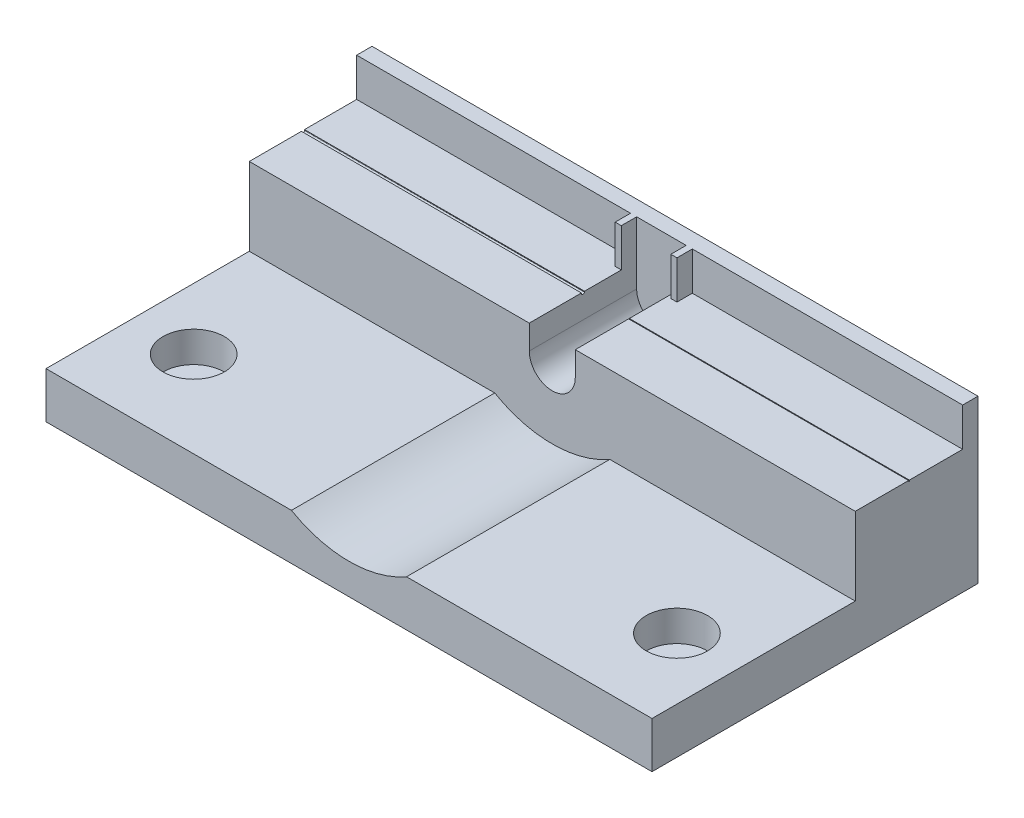
ISO-10303-21;
HEADER;
FILE_DESCRIPTION(('STEP AP214'),'2;1');
FILE_NAME('part.step','',(''),(''),'','','');
FILE_SCHEMA(('AUTOMOTIVE_DESIGN { 1 0 10303 214 1 1 1 1 }'));
ENDSEC;
DATA;
#1=APPLICATION_CONTEXT('core data for automotive mechanical design processes');
#2=APPLICATION_PROTOCOL_DEFINITION('international standard','automotive_design',2000,#1);
#3=PRODUCT_CONTEXT('',#1,'mechanical');
#4=PRODUCT('Part','Part','',(#3));
#5=PRODUCT_RELATED_PRODUCT_CATEGORY('part','',(#4));
#6=PRODUCT_DEFINITION_FORMATION('','',#4);
#7=PRODUCT_DEFINITION_CONTEXT('part definition',#1,'design');
#8=PRODUCT_DEFINITION('design','',#6,#7);
#9=PRODUCT_DEFINITION_SHAPE('','',#8);
#10=(LENGTH_UNIT() NAMED_UNIT(*) SI_UNIT(.MILLI.,.METRE.));
#11=(NAMED_UNIT(*) PLANE_ANGLE_UNIT() SI_UNIT($,.RADIAN.));
#12=(NAMED_UNIT(*) SI_UNIT($,.STERADIAN.) SOLID_ANGLE_UNIT());
#13=UNCERTAINTY_MEASURE_WITH_UNIT(LENGTH_MEASURE(1.E-05),#10,'distance_accuracy_value','');
#14=(GEOMETRIC_REPRESENTATION_CONTEXT(3) GLOBAL_UNCERTAINTY_ASSIGNED_CONTEXT((#13)) GLOBAL_UNIT_ASSIGNED_CONTEXT((#10,
#11,#12)) REPRESENTATION_CONTEXT('',''));
#15=CARTESIAN_POINT('',(0.,0.,0.));
#16=DIRECTION('',(0.,0.,1.));
#17=DIRECTION('',(1.,0.,0.));
#18=AXIS2_PLACEMENT_3D('',#15,#16,#17);
#19=CARTESIAN_POINT('',(-1.5,-1.425,-20.25));
#20=DIRECTION('',(0.,-1.,0.));
#21=DIRECTION('',(0.,0.,-1.));
#22=AXIS2_PLACEMENT_3D('',#19,#20,#21);
#23=PLANE('',#22);
#24=DIRECTION('',(0.,0.,1.));
#25=VECTOR('',#24,1.);
#26=CARTESIAN_POINT('',(-1.5,-1.425,-20.25));
#27=LINE('',#26,#25);
#28=CARTESIAN_POINT('',(-1.5,-1.425,-16.65));
#29=VERTEX_POINT('',#28);
#30=CARTESIAN_POINT('',(-1.5,-1.425,-13.25));
#31=VERTEX_POINT('',#30);
#32=EDGE_CURVE('E375',#29,#31,#27,.T.);
#33=ORIENTED_EDGE('',*,*,#32,.F.);
#34=DIRECTION('',(-1.,0.,0.));
#35=VECTOR('',#34,1.);
#36=CARTESIAN_POINT('',(-1.26037774849503,-1.425,-16.65));
#37=LINE('',#36,#35);
#38=CARTESIAN_POINT('',(-19.75,-1.425,-16.65));
#39=VERTEX_POINT('',#38);
#40=EDGE_CURVE('E533',#29,#39,#37,.T.);
#41=ORIENTED_EDGE('',*,*,#40,.T.);
#42=DIRECTION('',(0.,0.,1.));
#43=VECTOR('',#42,1.);
#44=CARTESIAN_POINT('',(-19.75,-1.425,-20.25));
#45=LINE('',#44,#43);
#46=CARTESIAN_POINT('',(-19.75,-1.425,-13.25));
#47=VERTEX_POINT('',#46);
#48=EDGE_CURVE('E288',#39,#47,#45,.T.);
#49=ORIENTED_EDGE('',*,*,#48,.T.);
#50=DIRECTION('',(1.,0.,0.));
#51=VECTOR('',#50,1.);
#52=CARTESIAN_POINT('',(-1.5,-1.425,-13.25));
#53=LINE('',#52,#51);
#54=EDGE_CURVE('E359',#47,#31,#53,.T.);
#55=ORIENTED_EDGE('',*,*,#54,.T.);
#56=EDGE_LOOP('',(#33,#41,#49,#55));
#57=FACE_BOUND('',#56,.T.);
#58=ADVANCED_FACE('F71',(#57),#23,.F.);
#59=CARTESIAN_POINT('',(1.5,-1.425,-20.25));
#60=DIRECTION('',(0.,-1.,0.));
#61=DIRECTION('',(1.,0.,0.));
#62=AXIS2_PLACEMENT_3D('',#59,#60,#61);
#63=PLANE('',#62);
#64=DIRECTION('',(0.,0.,1.));
#65=VECTOR('',#64,1.);
#66=CARTESIAN_POINT('',(19.75,-1.425,-20.25));
#67=LINE('',#66,#65);
#68=CARTESIAN_POINT('',(19.75,-1.425,-16.725));
#69=VERTEX_POINT('',#68);
#70=CARTESIAN_POINT('',(19.75,-1.425,-13.25));
#71=VERTEX_POINT('',#70);
#72=EDGE_CURVE('E287',#69,#71,#67,.T.);
#73=ORIENTED_EDGE('',*,*,#72,.F.);
#74=DIRECTION('',(1.,0.,0.));
#75=VECTOR('',#74,1.);
#76=CARTESIAN_POINT('',(1.4098612181134,-1.425,-16.725));
#77=LINE('',#76,#75);
#78=CARTESIAN_POINT('',(1.5,-1.425,-16.725));
#79=VERTEX_POINT('',#78);
#80=EDGE_CURVE('E549',#79,#69,#77,.T.);
#81=ORIENTED_EDGE('',*,*,#80,.F.);
#82=DIRECTION('',(0.,0.,1.));
#83=VECTOR('',#82,1.);
#84=CARTESIAN_POINT('',(1.5,-1.425,-20.25));
#85=LINE('',#84,#83);
#86=CARTESIAN_POINT('',(1.5,-1.425,-13.25));
#87=VERTEX_POINT('',#86);
#88=EDGE_CURVE('E297',#79,#87,#85,.T.);
#89=ORIENTED_EDGE('',*,*,#88,.T.);
#90=DIRECTION('',(1.,0.,0.));
#91=VECTOR('',#90,1.);
#92=CARTESIAN_POINT('',(1.5,-1.425,-13.25));
#93=LINE('',#92,#91);
#94=EDGE_CURVE('E395',#87,#71,#93,.T.);
#95=ORIENTED_EDGE('',*,*,#94,.T.);
#96=EDGE_LOOP('',(#73,#81,#89,#95));
#97=FACE_BOUND('',#96,.T.);
#98=ADVANCED_FACE('F578',(#97),#63,.F.);
#99=CARTESIAN_POINT('',(1.5,-1.425,-20.25));
#100=VERTEX_POINT('',#99);
#101=CARTESIAN_POINT('',(1.5,-1.425,-16.775));
#102=VERTEX_POINT('',#101);
#103=EDGE_CURVE('E298',#100,#102,#85,.T.);
#104=ORIENTED_EDGE('',*,*,#103,.T.);
#105=DIRECTION('',(1.,0.,0.));
#106=VECTOR('',#105,1.);
#107=CARTESIAN_POINT('',(1.4098612181134,-1.425,-16.775));
#108=LINE('',#107,#106);
#109=CARTESIAN_POINT('',(19.75,-1.425,-16.775));
#110=VERTEX_POINT('',#109);
#111=EDGE_CURVE('E559',#102,#110,#108,.T.);
#112=ORIENTED_EDGE('',*,*,#111,.T.);
#113=CARTESIAN_POINT('',(19.75,-1.425,-20.25));
#114=VERTEX_POINT('',#113);
#115=EDGE_CURVE('E290',#114,#110,#67,.T.);
#116=ORIENTED_EDGE('',*,*,#115,.F.);
#117=DIRECTION('',(1.,0.,0.));
#118=VECTOR('',#117,1.);
#119=CARTESIAN_POINT('',(1.5,-1.425,-20.25));
#120=LINE('',#119,#118);
#121=CARTESIAN_POINT('',(2.12919977469738,-1.425,-20.25));
#122=VERTEX_POINT('',#121);
#123=EDGE_CURVE('E486',#122,#114,#120,.T.);
#124=ORIENTED_EDGE('',*,*,#123,.F.);
#125=DIRECTION('',(0.,0.,-1.));
#126=VECTOR('',#125,1.);
#127=CARTESIAN_POINT('',(2.12919977469738,-1.425,-19.25));
#128=LINE('',#127,#126);
#129=CARTESIAN_POINT('',(2.12919977469738,-1.425,-19.25));
#130=VERTEX_POINT('',#129);
#131=EDGE_CURVE('E423',#130,#122,#128,.T.);
#132=ORIENTED_EDGE('',*,*,#131,.F.);
#133=DIRECTION('',(1.,0.,0.));
#134=VECTOR('',#133,1.);
#135=CARTESIAN_POINT('',(1.72919977469738,-1.425,-19.25));
#136=LINE('',#135,#134);
#137=CARTESIAN_POINT('',(1.72919977469738,-1.425,-19.25));
#138=VERTEX_POINT('',#137);
#139=EDGE_CURVE('E454',#138,#130,#136,.T.);
#140=ORIENTED_EDGE('',*,*,#139,.F.);
#141=DIRECTION('',(0.,0.,-1.));
#142=VECTOR('',#141,1.);
#143=CARTESIAN_POINT('',(1.72919977469738,-1.425,-19.25));
#144=LINE('',#143,#142);
#145=CARTESIAN_POINT('',(1.72919977469738,-1.425,-20.25));
#146=VERTEX_POINT('',#145);
#147=EDGE_CURVE('E446',#138,#146,#144,.T.);
#148=ORIENTED_EDGE('',*,*,#147,.T.);
#149=EDGE_CURVE('E385',#100,#146,#120,.T.);
#150=ORIENTED_EDGE('',*,*,#149,.F.);
#151=EDGE_LOOP('',(#104,#112,#116,#124,#132,#140,#148,#150));
#152=FACE_BOUND('',#151,.T.);
#153=ADVANCED_FACE('F506',(#152),#63,.F.);
#154=CARTESIAN_POINT('',(-19.75,-6.4951905283833,-13.25));
#155=DIRECTION('',(-1.,0.,0.));
#156=DIRECTION('',(0.,0.,1.));
#157=AXIS2_PLACEMENT_3D('',#154,#155,#156);
#158=PLANE('',#157);
#159=DIRECTION('',(0.,1.,0.));
#160=VECTOR('',#159,1.);
#161=CARTESIAN_POINT('',(-19.75,-1.425,-16.65));
#162=LINE('',#161,#160);
#163=CARTESIAN_POINT('',(-19.75,-1.475,-16.65));
#164=VERTEX_POINT('',#163);
#165=EDGE_CURVE('E272',#164,#39,#162,.T.);
#166=ORIENTED_EDGE('',*,*,#165,.F.);
#167=CARTESIAN_POINT('',(-19.75,-1.455,-16.75));
#168=DIRECTION('',(-1.,0.,0.));
#169=DIRECTION('',(0.,0.,1.));
#170=AXIS2_PLACEMENT_3D('',#167,#168,#169);
#171=CIRCLE('',#170,0.101980390271854);
#172=CARTESIAN_POINT('',(-19.75,-1.475,-16.85));
#173=VERTEX_POINT('',#172);
#174=EDGE_CURVE('E279',#173,#164,#171,.T.);
#175=ORIENTED_EDGE('',*,*,#174,.F.);
#176=DIRECTION('',(0.,-1.,0.));
#177=VECTOR('',#176,1.);
#178=CARTESIAN_POINT('',(-19.75,-1.425,-16.85));
#179=LINE('',#178,#177);
#180=CARTESIAN_POINT('',(-19.75,-1.425,-16.85));
#181=VERTEX_POINT('',#180);
#182=EDGE_CURVE('E264',#181,#173,#179,.T.);
#183=ORIENTED_EDGE('',*,*,#182,.F.);
#184=CARTESIAN_POINT('',(-19.75,-1.425,-20.25));
#185=VERTEX_POINT('',#184);
#186=EDGE_CURVE('E276',#185,#181,#45,.T.);
#187=ORIENTED_EDGE('',*,*,#186,.F.);
#188=DIRECTION('',(0.,1.,0.));
#189=VECTOR('',#188,1.);
#190=CARTESIAN_POINT('',(-19.75,0.,-20.25));
#191=LINE('',#190,#189);
#192=CARTESIAN_POINT('',(-19.75,1.075,-20.25));
#193=VERTEX_POINT('',#192);
#194=EDGE_CURVE('E427',#185,#193,#191,.T.);
#195=ORIENTED_EDGE('',*,*,#194,.T.);
#196=DIRECTION('',(0.,0.,1.));
#197=VECTOR('',#196,1.);
#198=CARTESIAN_POINT('',(-19.75,1.075,-21.25));
#199=LINE('',#198,#197);
#200=CARTESIAN_POINT('',(-19.75,1.075,-21.25));
#201=VERTEX_POINT('',#200);
#202=EDGE_CURVE('E420',#201,#193,#199,.T.);
#203=ORIENTED_EDGE('',*,*,#202,.F.);
#204=DIRECTION('',(0.,1.,0.));
#205=VECTOR('',#204,1.);
#206=CARTESIAN_POINT('',(-19.75,0.,-21.25));
#207=LINE('',#206,#205);
#208=CARTESIAN_POINT('',(-19.75,-9.5,-21.25));
#209=VERTEX_POINT('',#208);
#210=EDGE_CURVE('E344',#209,#201,#207,.T.);
#211=ORIENTED_EDGE('',*,*,#210,.F.);
#212=DIRECTION('',(0.,0.,1.));
#213=VECTOR('',#212,1.);
#214=CARTESIAN_POINT('',(-19.75,-9.5,-13.25));
#215=LINE('',#214,#213);
#216=CARTESIAN_POINT('',(-19.75,-9.5,0.));
#217=VERTEX_POINT('',#216);
#218=EDGE_CURVE('E75',#209,#217,#215,.T.);
#219=ORIENTED_EDGE('',*,*,#218,.T.);
#220=DIRECTION('',(0.,-1.,0.));
#221=VECTOR('',#220,1.);
#222=CARTESIAN_POINT('',(-19.75,-6.4951905283833,0.));
#223=LINE('',#222,#221);
#224=CARTESIAN_POINT('',(-19.75,-6.4951905283833,0.));
#225=VERTEX_POINT('',#224);
#226=EDGE_CURVE('E304',#225,#217,#223,.T.);
#227=ORIENTED_EDGE('',*,*,#226,.F.);
#228=DIRECTION('',(0.,0.,1.));
#229=VECTOR('',#228,1.);
#230=CARTESIAN_POINT('',(-19.75,-6.4951905283833,-13.25));
#231=LINE('',#230,#229);
#232=CARTESIAN_POINT('',(-19.75,-6.4951905283833,-13.25));
#233=VERTEX_POINT('',#232);
#234=EDGE_CURVE('E12',#233,#225,#231,.T.);
#235=ORIENTED_EDGE('',*,*,#234,.F.);
#236=DIRECTION('',(0.,1.,0.));
#237=VECTOR('',#236,1.);
#238=CARTESIAN_POINT('',(-19.75,-1.425,-13.25));
#239=LINE('',#238,#237);
#240=EDGE_CURVE('E356',#233,#47,#239,.T.);
#241=ORIENTED_EDGE('',*,*,#240,.T.);
#242=ORIENTED_EDGE('',*,*,#48,.F.);
#243=EDGE_LOOP('',(#166,#175,#183,#187,#195,#203,#211,#219,#227,#235,#241,#242));
#244=FACE_BOUND('',#243,.T.);
#245=ADVANCED_FACE('F73',(#244),#158,.T.);
#246=CARTESIAN_POINT('',(-3.74999999999998,-6.4951905283833,-13.25));
#247=DIRECTION('',(0.,1.,0.));
#248=DIRECTION('',(-1.,0.,0.));
#249=AXIS2_PLACEMENT_3D('',#246,#247,#248);
#250=PLANE('',#249);
#251=CARTESIAN_POINT('',(-15.75,-6.4951905283833,-5.625));
#252=DIRECTION('',(0.,1.,0.));
#253=DIRECTION('',(-1.,0.,0.));
#254=AXIS2_PLACEMENT_3D('',#251,#252,#253);
#255=CIRCLE('',#254,2.);
#256=CARTESIAN_POINT('',(-17.75,-6.4951905283833,-5.625));
#257=VERTEX_POINT('',#256);
#258=EDGE_CURVE('E659',#257,#257,#255,.T.);
#259=ORIENTED_EDGE('',*,*,#258,.F.);
#260=EDGE_LOOP('',(#259));
#261=FACE_BOUND('',#260,.T.);
#262=DIRECTION('',(-1.,0.,0.));
#263=VECTOR('',#262,1.);
#264=CARTESIAN_POINT('',(-3.74999999999998,-6.4951905283833,0.));
#265=LINE('',#264,#263);
#266=CARTESIAN_POINT('',(-3.74999999999998,-6.4951905283833,0.));
#267=VERTEX_POINT('',#266);
#268=EDGE_CURVE('E309',#267,#225,#265,.T.);
#269=ORIENTED_EDGE('',*,*,#268,.F.);
#270=DIRECTION('',(0.,0.,1.));
#271=VECTOR('',#270,1.);
#272=CARTESIAN_POINT('',(-3.74999999999998,-6.4951905283833,-13.25));
#273=LINE('',#272,#271);
#274=CARTESIAN_POINT('',(-3.74999999999998,-6.4951905283833,-13.25));
#275=VERTEX_POINT('',#274);
#276=EDGE_CURVE('E80',#275,#267,#273,.T.);
#277=ORIENTED_EDGE('',*,*,#276,.F.);
#278=DIRECTION('',(-1.,0.,0.));
#279=VECTOR('',#278,1.);
#280=CARTESIAN_POINT('',(-3.74999999999998,-6.4951905283833,-13.25));
#281=LINE('',#280,#279);
#282=EDGE_CURVE('E312',#275,#233,#281,.T.);
#283=ORIENTED_EDGE('',*,*,#282,.T.);
#284=ORIENTED_EDGE('',*,*,#234,.T.);
#285=EDGE_LOOP('',(#269,#277,#283,#284));
#286=FACE_BOUND('',#285,.T.);
#287=ADVANCED_FACE('F353',(#261,#286),#250,.T.);
#288=CARTESIAN_POINT('',(0.,0.,-13.25));
#289=DIRECTION('',(0.,0.,1.));
#290=DIRECTION('',(1.,0.,0.));
#291=AXIS2_PLACEMENT_3D('',#288,#289,#290);
#292=CYLINDRICAL_SURFACE('',#291,7.5);
#293=CARTESIAN_POINT('',(0.,0.,0.));
#294=DIRECTION('',(0.,0.,-1.));
#295=DIRECTION('',(1.,0.,0.));
#296=AXIS2_PLACEMENT_3D('',#293,#294,#295);
#297=CIRCLE('',#296,7.5);
#298=CARTESIAN_POINT('',(3.74999999999998,-6.4951905283833,0.));
#299=VERTEX_POINT('',#298);
#300=EDGE_CURVE('E326',#299,#267,#297,.T.);
#301=ORIENTED_EDGE('',*,*,#300,.F.);
#302=DIRECTION('',(0.,0.,1.));
#303=VECTOR('',#302,1.);
#304=CARTESIAN_POINT('',(3.74999999999998,-6.4951905283833,-13.25));
#305=LINE('',#304,#303);
#306=CARTESIAN_POINT('',(3.74999999999998,-6.4951905283833,-13.25));
#307=VERTEX_POINT('',#306);
#308=EDGE_CURVE('E332',#307,#299,#305,.T.);
#309=ORIENTED_EDGE('',*,*,#308,.F.);
#310=CARTESIAN_POINT('',(0.,0.,-13.25));
#311=DIRECTION('',(0.,0.,-1.));
#312=DIRECTION('',(1.,0.,0.));
#313=AXIS2_PLACEMENT_3D('',#310,#311,#312);
#314=CIRCLE('',#313,7.5);
#315=EDGE_CURVE('E308',#307,#275,#314,.T.);
#316=ORIENTED_EDGE('',*,*,#315,.T.);
#317=ORIENTED_EDGE('',*,*,#276,.T.);
#318=EDGE_LOOP('',(#301,#309,#316,#317));
#319=FACE_BOUND('',#318,.T.);
#320=ADVANCED_FACE('F676',(#319),#292,.F.);
#321=CARTESIAN_POINT('',(3.74999999999998,-6.4951905283833,-13.25));
#322=DIRECTION('',(0.,1.,0.));
#323=DIRECTION('',(-1.,0.,0.));
#324=AXIS2_PLACEMENT_3D('',#321,#322,#323);
#325=PLANE('',#324);
#326=CARTESIAN_POINT('',(15.75,-6.4951905283833,-5.625));
#327=DIRECTION('',(0.,1.,0.));
#328=DIRECTION('',(-1.,0.,0.));
#329=AXIS2_PLACEMENT_3D('',#326,#327,#328);
#330=CIRCLE('',#329,2.);
#331=CARTESIAN_POINT('',(13.75,-6.4951905283833,-5.625));
#332=VERTEX_POINT('',#331);
#333=EDGE_CURVE('E662',#332,#332,#330,.T.);
#334=ORIENTED_EDGE('',*,*,#333,.F.);
#335=EDGE_LOOP('',(#334));
#336=FACE_BOUND('',#335,.T.);
#337=DIRECTION('',(-1.,0.,0.));
#338=VECTOR('',#337,1.);
#339=CARTESIAN_POINT('',(3.74999999999998,-6.4951905283833,0.));
#340=LINE('',#339,#338);
#341=CARTESIAN_POINT('',(19.75,-6.4951905283833,0.));
#342=VERTEX_POINT('',#341);
#343=EDGE_CURVE('E323',#342,#299,#340,.T.);
#344=ORIENTED_EDGE('',*,*,#343,.F.);
#345=DIRECTION('',(0.,0.,1.));
#346=VECTOR('',#345,1.);
#347=CARTESIAN_POINT('',(19.75,-6.4951905283833,-13.25));
#348=LINE('',#347,#346);
#349=CARTESIAN_POINT('',(19.75,-6.4951905283833,-13.25));
#350=VERTEX_POINT('',#349);
#351=EDGE_CURVE('E334',#350,#342,#348,.T.);
#352=ORIENTED_EDGE('',*,*,#351,.F.);
#353=DIRECTION('',(-1.,0.,0.));
#354=VECTOR('',#353,1.);
#355=CARTESIAN_POINT('',(3.74999999999998,-6.4951905283833,-13.25));
#356=LINE('',#355,#354);
#357=EDGE_CURVE('E305',#350,#307,#356,.T.);
#358=ORIENTED_EDGE('',*,*,#357,.T.);
#359=ORIENTED_EDGE('',*,*,#308,.T.);
#360=EDGE_LOOP('',(#344,#352,#358,#359));
#361=FACE_BOUND('',#360,.T.);
#362=ADVANCED_FACE('F407',(#336,#361),#325,.T.);
#363=CARTESIAN_POINT('',(19.75,-6.4951905283833,-13.25));
#364=DIRECTION('',(1.,0.,0.));
#365=DIRECTION('',(0.,0.,-1.));
#366=AXIS2_PLACEMENT_3D('',#363,#364,#365);
#367=PLANE('',#366);
#368=DIRECTION('',(0.,-1.,0.));
#369=VECTOR('',#368,1.);
#370=CARTESIAN_POINT('',(19.75,-1.425,-16.725));
#371=LINE('',#370,#369);
#372=CARTESIAN_POINT('',(19.75,-1.475,-16.725));
#373=VERTEX_POINT('',#372);
#374=EDGE_CURVE('E545',#69,#373,#371,.T.);
#375=ORIENTED_EDGE('',*,*,#374,.F.);
#376=ORIENTED_EDGE('',*,*,#72,.T.);
#377=DIRECTION('',(0.,-1.,0.));
#378=VECTOR('',#377,1.);
#379=CARTESIAN_POINT('',(19.75,-1.425,-13.25));
#380=LINE('',#379,#378);
#381=EDGE_CURVE('E360',#71,#350,#380,.T.);
#382=ORIENTED_EDGE('',*,*,#381,.T.);
#383=ORIENTED_EDGE('',*,*,#351,.T.);
#384=DIRECTION('',(0.,1.,0.));
#385=VECTOR('',#384,1.);
#386=CARTESIAN_POINT('',(19.75,-6.4951905283833,0.));
#387=LINE('',#386,#385);
#388=CARTESIAN_POINT('',(19.75,-9.5,0.));
#389=VERTEX_POINT('',#388);
#390=EDGE_CURVE('E320',#389,#342,#387,.T.);
#391=ORIENTED_EDGE('',*,*,#390,.F.);
#392=DIRECTION('',(0.,0.,1.));
#393=VECTOR('',#392,1.);
#394=CARTESIAN_POINT('',(19.75,-9.5,-13.25));
#395=LINE('',#394,#393);
#396=CARTESIAN_POINT('',(19.75,-9.5,-21.25));
#397=VERTEX_POINT('',#396);
#398=EDGE_CURVE('E335',#397,#389,#395,.T.);
#399=ORIENTED_EDGE('',*,*,#398,.F.);
#400=DIRECTION('',(0.,-1.,0.));
#401=VECTOR('',#400,1.);
#402=CARTESIAN_POINT('',(19.75,0.,-21.25));
#403=LINE('',#402,#401);
#404=CARTESIAN_POINT('',(19.75,1.075,-21.25));
#405=VERTEX_POINT('',#404);
#406=EDGE_CURVE('E412',#405,#397,#403,.T.);
#407=ORIENTED_EDGE('',*,*,#406,.F.);
#408=DIRECTION('',(0.,0.,1.));
#409=VECTOR('',#408,1.);
#410=CARTESIAN_POINT('',(19.75,1.075,-21.25));
#411=LINE('',#410,#409);
#412=CARTESIAN_POINT('',(19.75,1.075,-20.25));
#413=VERTEX_POINT('',#412);
#414=EDGE_CURVE('E430',#405,#413,#411,.T.);
#415=ORIENTED_EDGE('',*,*,#414,.T.);
#416=DIRECTION('',(0.,-1.,0.));
#417=VECTOR('',#416,1.);
#418=CARTESIAN_POINT('',(19.75,0.,-20.25));
#419=LINE('',#418,#417);
#420=EDGE_CURVE('E434',#413,#114,#419,.T.);
#421=ORIENTED_EDGE('',*,*,#420,.T.);
#422=ORIENTED_EDGE('',*,*,#115,.T.);
#423=DIRECTION('',(0.,1.,0.));
#424=VECTOR('',#423,1.);
#425=CARTESIAN_POINT('',(19.75,-1.475,-16.775));
#426=LINE('',#425,#424);
#427=CARTESIAN_POINT('',(19.75,-1.475,-16.775));
#428=VERTEX_POINT('',#427);
#429=EDGE_CURVE('E555',#428,#110,#426,.T.);
#430=ORIENTED_EDGE('',*,*,#429,.F.);
#431=CARTESIAN_POINT('',(19.75,-1.475,-16.75));
#432=DIRECTION('',(1.,0.,0.));
#433=DIRECTION('',(0.,0.,-1.));
#434=AXIS2_PLACEMENT_3D('',#431,#432,#433);
#435=CIRCLE('',#434,0.0250000000000007);
#436=EDGE_CURVE('E553',#373,#428,#435,.T.);
#437=ORIENTED_EDGE('',*,*,#436,.F.);
#438=EDGE_LOOP('',(#375,#376,#382,#383,#391,#399,#407,#415,#421,#422,#430,#437));
#439=FACE_BOUND('',#438,.T.);
#440=ADVANCED_FACE('F402',(#439),#367,.T.);
#441=CARTESIAN_POINT('',(-19.75,-9.5,-13.25));
#442=DIRECTION('',(0.,-1.,0.));
#443=DIRECTION('',(0.,0.,-1.));
#444=AXIS2_PLACEMENT_3D('',#441,#442,#443);
#445=PLANE('',#444);
#446=DIRECTION('',(1.,0.,0.));
#447=VECTOR('',#446,1.);
#448=CARTESIAN_POINT('',(-19.75,-9.5,0.));
#449=LINE('',#448,#447);
#450=EDGE_CURVE('E317',#217,#389,#449,.T.);
#451=ORIENTED_EDGE('',*,*,#450,.F.);
#452=ORIENTED_EDGE('',*,*,#218,.F.);
#453=DIRECTION('',(-1.,0.,0.));
#454=VECTOR('',#453,1.);
#455=CARTESIAN_POINT('',(0.,-9.5,-21.25));
#456=LINE('',#455,#454);
#457=EDGE_CURVE('E416',#397,#209,#456,.T.);
#458=ORIENTED_EDGE('',*,*,#457,.F.);
#459=ORIENTED_EDGE('',*,*,#398,.T.);
#460=EDGE_LOOP('',(#451,#452,#458,#459));
#461=FACE_BOUND('',#460,.T.);
#462=ADVANCED_FACE('F346',(#461),#445,.T.);
#463=CARTESIAN_POINT('',(0.,0.,0.));
#464=DIRECTION('',(0.,0.,1.));
#465=DIRECTION('',(1.,0.,0.));
#466=AXIS2_PLACEMENT_3D('',#463,#464,#465);
#467=PLANE('',#466);
#468=ORIENTED_EDGE('',*,*,#226,.T.);
#469=ORIENTED_EDGE('',*,*,#450,.T.);
#470=ORIENTED_EDGE('',*,*,#390,.T.);
#471=ORIENTED_EDGE('',*,*,#343,.T.);
#472=ORIENTED_EDGE('',*,*,#300,.T.);
#473=ORIENTED_EDGE('',*,*,#268,.T.);
#474=EDGE_LOOP('',(#468,#469,#470,#471,#472,#473));
#475=FACE_BOUND('',#474,.T.);
#476=ADVANCED_FACE('F348',(#475),#467,.T.);
#477=CARTESIAN_POINT('',(0.,-3.,-20.25));
#478=DIRECTION('',(0.,0.,1.));
#479=DIRECTION('',(1.,0.,0.));
#480=AXIS2_PLACEMENT_3D('',#477,#478,#479);
#481=CYLINDRICAL_SURFACE('',#480,1.5);
#482=CARTESIAN_POINT('',(0.,-3.,-13.25));
#483=DIRECTION('',(0.,0.,1.));
#484=DIRECTION('',(-1.,0.,0.));
#485=AXIS2_PLACEMENT_3D('',#482,#483,#484);
#486=CIRCLE('',#485,1.5);
#487=CARTESIAN_POINT('',(-1.5,-3.,-13.25));
#488=VERTEX_POINT('',#487);
#489=CARTESIAN_POINT('',(1.5,-3.,-13.25));
#490=VERTEX_POINT('',#489);
#491=EDGE_CURVE('E389',#488,#490,#486,.T.);
#492=ORIENTED_EDGE('',*,*,#491,.T.);
#493=DIRECTION('',(0.,0.,1.));
#494=VECTOR('',#493,1.);
#495=CARTESIAN_POINT('',(1.5,-3.,-20.25));
#496=LINE('',#495,#494);
#497=CARTESIAN_POINT('',(1.5,-3.,-20.25));
#498=VERTEX_POINT('',#497);
#499=EDGE_CURVE('E301',#498,#490,#496,.T.);
#500=ORIENTED_EDGE('',*,*,#499,.F.);
#501=CARTESIAN_POINT('',(0.,-3.,-20.25));
#502=DIRECTION('',(0.,0.,1.));
#503=DIRECTION('',(-1.,0.,0.));
#504=AXIS2_PLACEMENT_3D('',#501,#502,#503);
#505=CIRCLE('',#504,1.5);
#506=CARTESIAN_POINT('',(-1.5,-3.,-20.25));
#507=VERTEX_POINT('',#506);
#508=EDGE_CURVE('E370',#507,#498,#505,.T.);
#509=ORIENTED_EDGE('',*,*,#508,.F.);
#510=DIRECTION('',(0.,0.,1.));
#511=VECTOR('',#510,1.);
#512=CARTESIAN_POINT('',(-1.5,-3.,-20.25));
#513=LINE('',#512,#511);
#514=EDGE_CURVE('E373',#507,#488,#513,.T.);
#515=ORIENTED_EDGE('',*,*,#514,.T.);
#516=EDGE_LOOP('',(#492,#500,#509,#515));
#517=FACE_BOUND('',#516,.T.);
#518=ADVANCED_FACE('F582',(#517),#481,.F.);
#519=CARTESIAN_POINT('',(1.5,-3.,-20.25));
#520=DIRECTION('',(1.,0.,0.));
#521=DIRECTION('',(0.,0.,-1.));
#522=AXIS2_PLACEMENT_3D('',#519,#520,#521);
#523=PLANE('',#522);
#524=ORIENTED_EDGE('',*,*,#88,.F.);
#525=DIRECTION('',(0.,1.,0.));
#526=VECTOR('',#525,1.);
#527=CARTESIAN_POINT('',(1.5,-1.425,-16.725));
#528=LINE('',#527,#526);
#529=CARTESIAN_POINT('',(1.5,-1.475,-16.725));
#530=VERTEX_POINT('',#529);
#531=EDGE_CURVE('E548',#530,#79,#528,.T.);
#532=ORIENTED_EDGE('',*,*,#531,.F.);
#533=CARTESIAN_POINT('',(1.5,-1.475,-16.75));
#534=DIRECTION('',(1.,0.,0.));
#535=DIRECTION('',(0.,0.,-1.));
#536=AXIS2_PLACEMENT_3D('',#533,#534,#535);
#537=CIRCLE('',#536,0.0250000000000007);
#538=CARTESIAN_POINT('',(1.5,-1.475,-16.775));
#539=VERTEX_POINT('',#538);
#540=EDGE_CURVE('E439',#539,#530,#537,.F.);
#541=ORIENTED_EDGE('',*,*,#540,.F.);
#542=DIRECTION('',(0.,-1.,0.));
#543=VECTOR('',#542,1.);
#544=CARTESIAN_POINT('',(1.5,-1.475,-16.775));
#545=LINE('',#544,#543);
#546=EDGE_CURVE('E546',#102,#539,#545,.T.);
#547=ORIENTED_EDGE('',*,*,#546,.F.);
#548=ORIENTED_EDGE('',*,*,#103,.F.);
#549=DIRECTION('',(0.,1.,0.));
#550=VECTOR('',#549,1.);
#551=CARTESIAN_POINT('',(1.5,-3.,-20.25));
#552=LINE('',#551,#550);
#553=EDGE_CURVE('E484',#498,#100,#552,.T.);
#554=ORIENTED_EDGE('',*,*,#553,.F.);
#555=ORIENTED_EDGE('',*,*,#499,.T.);
#556=DIRECTION('',(0.,1.,0.));
#557=VECTOR('',#556,1.);
#558=CARTESIAN_POINT('',(1.5,-3.,-13.25));
#559=LINE('',#558,#557);
#560=EDGE_CURVE('E391',#490,#87,#559,.T.);
#561=ORIENTED_EDGE('',*,*,#560,.T.);
#562=EDGE_LOOP('',(#524,#532,#541,#547,#548,#554,#555,#561));
#563=FACE_BOUND('',#562,.T.);
#564=ADVANCED_FACE('F576',(#563),#523,.F.);
#565=ORIENTED_EDGE('',*,*,#186,.T.);
#566=DIRECTION('',(-1.,0.,0.));
#567=VECTOR('',#566,1.);
#568=CARTESIAN_POINT('',(-1.26037774849503,-1.425,-16.85));
#569=LINE('',#568,#567);
#570=CARTESIAN_POINT('',(-1.5,-1.425,-16.85));
#571=VERTEX_POINT('',#570);
#572=EDGE_CURVE('E261',#571,#181,#569,.T.);
#573=ORIENTED_EDGE('',*,*,#572,.F.);
#574=CARTESIAN_POINT('',(-1.5,-1.425,-19.25));
#575=VERTEX_POINT('',#574);
#576=EDGE_CURVE('E292',#575,#571,#27,.T.);
#577=ORIENTED_EDGE('',*,*,#576,.F.);
#578=DIRECTION('',(1.,0.,0.));
#579=VECTOR('',#578,1.);
#580=CARTESIAN_POINT('',(0.,-1.425,-19.25));
#581=LINE('',#580,#579);
#582=CARTESIAN_POINT('',(-1.9,-1.425,-19.25));
#583=VERTEX_POINT('',#582);
#584=EDGE_CURVE('E465',#583,#575,#581,.T.);
#585=ORIENTED_EDGE('',*,*,#584,.F.);
#586=DIRECTION('',(0.,0.,-1.));
#587=VECTOR('',#586,1.);
#588=CARTESIAN_POINT('',(-1.9,-1.425,-19.25));
#589=LINE('',#588,#587);
#590=CARTESIAN_POINT('',(-1.9,-1.425,-20.25));
#591=VERTEX_POINT('',#590);
#592=EDGE_CURVE('E475',#583,#591,#589,.T.);
#593=ORIENTED_EDGE('',*,*,#592,.T.);
#594=DIRECTION('',(1.,0.,0.));
#595=VECTOR('',#594,1.);
#596=CARTESIAN_POINT('',(-1.5,-1.425,-20.25));
#597=LINE('',#596,#595);
#598=EDGE_CURVE('E285',#185,#591,#597,.T.);
#599=ORIENTED_EDGE('',*,*,#598,.F.);
#600=EDGE_LOOP('',(#565,#573,#577,#585,#593,#599));
#601=FACE_BOUND('',#600,.T.);
#602=ADVANCED_FACE('F282',(#601),#23,.F.);
#603=CARTESIAN_POINT('',(-1.5,-3.,-20.25));
#604=DIRECTION('',(-1.,0.,0.));
#605=DIRECTION('',(0.,0.,1.));
#606=AXIS2_PLACEMENT_3D('',#603,#604,#605);
#607=PLANE('',#606);
#608=CARTESIAN_POINT('',(-1.5,-1.455,-16.75));
#609=DIRECTION('',(-1.,0.,0.));
#610=DIRECTION('',(0.,0.,1.));
#611=AXIS2_PLACEMENT_3D('',#608,#609,#610);
#612=CIRCLE('',#611,0.101980390271854);
#613=CARTESIAN_POINT('',(-1.5,-1.475,-16.65));
#614=VERTEX_POINT('',#613);
#615=CARTESIAN_POINT('',(-1.5,-1.475,-16.85));
#616=VERTEX_POINT('',#615);
#617=EDGE_CURVE('E535',#614,#616,#612,.F.);
#618=ORIENTED_EDGE('',*,*,#617,.F.);
#619=DIRECTION('',(0.,-1.,0.));
#620=VECTOR('',#619,1.);
#621=CARTESIAN_POINT('',(-1.5,-1.425,-16.65));
#622=LINE('',#621,#620);
#623=EDGE_CURVE('E531',#29,#614,#622,.T.);
#624=ORIENTED_EDGE('',*,*,#623,.F.);
#625=ORIENTED_EDGE('',*,*,#32,.T.);
#626=DIRECTION('',(0.,-1.,0.));
#627=VECTOR('',#626,1.);
#628=CARTESIAN_POINT('',(-1.5,-3.,-13.25));
#629=LINE('',#628,#627);
#630=EDGE_CURVE('E366',#31,#488,#629,.T.);
#631=ORIENTED_EDGE('',*,*,#630,.T.);
#632=ORIENTED_EDGE('',*,*,#514,.F.);
#633=DIRECTION('',(0.,-1.,0.));
#634=VECTOR('',#633,1.);
#635=CARTESIAN_POINT('',(-1.5,-3.,-20.25));
#636=LINE('',#635,#634);
#637=CARTESIAN_POINT('',(-1.5,1.075,-20.25));
#638=VERTEX_POINT('',#637);
#639=EDGE_CURVE('E376',#638,#507,#636,.T.);
#640=ORIENTED_EDGE('',*,*,#639,.F.);
#641=DIRECTION('',(0.,0.,-1.));
#642=VECTOR('',#641,1.);
#643=CARTESIAN_POINT('',(-1.5,1.075,-19.25));
#644=LINE('',#643,#642);
#645=CARTESIAN_POINT('',(-1.5,1.075,-19.25));
#646=VERTEX_POINT('',#645);
#647=EDGE_CURVE('E392',#646,#638,#644,.T.);
#648=ORIENTED_EDGE('',*,*,#647,.F.);
#649=DIRECTION('',(0.,1.,0.));
#650=VECTOR('',#649,1.);
#651=CARTESIAN_POINT('',(-1.5,0.,-19.25));
#652=LINE('',#651,#650);
#653=EDGE_CURVE('E473',#575,#646,#652,.T.);
#654=ORIENTED_EDGE('',*,*,#653,.F.);
#655=ORIENTED_EDGE('',*,*,#576,.T.);
#656=DIRECTION('',(0.,1.,0.));
#657=VECTOR('',#656,1.);
#658=CARTESIAN_POINT('',(-1.5,-1.425,-16.85));
#659=LINE('',#658,#657);
#660=EDGE_CURVE('E267',#616,#571,#659,.T.);
#661=ORIENTED_EDGE('',*,*,#660,.F.);
#662=EDGE_LOOP('',(#618,#624,#625,#631,#632,#640,#648,#654,#655,#661));
#663=FACE_BOUND('',#662,.T.);
#664=ADVANCED_FACE('F529',(#663),#607,.F.);
#665=CARTESIAN_POINT('',(0.,-3.,-13.25));
#666=DIRECTION('',(0.,0.,-1.));
#667=DIRECTION('',(-1.,0.,0.));
#668=AXIS2_PLACEMENT_3D('',#665,#666,#667);
#669=PLANE('',#668);
#670=ORIENTED_EDGE('',*,*,#282,.F.);
#671=ORIENTED_EDGE('',*,*,#315,.F.);
#672=ORIENTED_EDGE('',*,*,#357,.F.);
#673=ORIENTED_EDGE('',*,*,#381,.F.);
#674=ORIENTED_EDGE('',*,*,#94,.F.);
#675=ORIENTED_EDGE('',*,*,#560,.F.);
#676=ORIENTED_EDGE('',*,*,#491,.F.);
#677=ORIENTED_EDGE('',*,*,#630,.F.);
#678=ORIENTED_EDGE('',*,*,#54,.F.);
#679=ORIENTED_EDGE('',*,*,#240,.F.);
#680=EDGE_LOOP('',(#670,#671,#672,#673,#674,#675,#676,#677,#678,#679));
#681=FACE_BOUND('',#680,.T.);
#682=ADVANCED_FACE('F364',(#681),#669,.F.);
#683=CARTESIAN_POINT('',(0.,1.075,-19.25));
#684=DIRECTION('',(0.,-1.,0.));
#685=DIRECTION('',(0.,0.,-1.));
#686=AXIS2_PLACEMENT_3D('',#683,#684,#685);
#687=PLANE('',#686);
#688=ORIENTED_EDGE('',*,*,#647,.T.);
#689=DIRECTION('',(-1.,0.,0.));
#690=VECTOR('',#689,1.);
#691=CARTESIAN_POINT('',(0.,1.075,-20.25));
#692=LINE('',#691,#690);
#693=CARTESIAN_POINT('',(1.72919977469738,1.075,-20.25));
#694=VERTEX_POINT('',#693);
#695=EDGE_CURVE('E435',#694,#638,#692,.T.);
#696=ORIENTED_EDGE('',*,*,#695,.F.);
#697=DIRECTION('',(0.,0.,-1.));
#698=VECTOR('',#697,1.);
#699=CARTESIAN_POINT('',(1.72919977469738,1.075,-19.25));
#700=LINE('',#699,#698);
#701=CARTESIAN_POINT('',(1.72919977469738,1.075,-19.25));
#702=VERTEX_POINT('',#701);
#703=EDGE_CURVE('E444',#702,#694,#700,.T.);
#704=ORIENTED_EDGE('',*,*,#703,.F.);
#705=DIRECTION('',(-1.,0.,0.));
#706=VECTOR('',#705,1.);
#707=CARTESIAN_POINT('',(2.12919977469738,1.075,-19.25));
#708=LINE('',#707,#706);
#709=CARTESIAN_POINT('',(2.12919977469738,1.075,-19.25));
#710=VERTEX_POINT('',#709);
#711=EDGE_CURVE('E459',#710,#702,#708,.T.);
#712=ORIENTED_EDGE('',*,*,#711,.F.);
#713=DIRECTION('',(0.,0.,-1.));
#714=VECTOR('',#713,1.);
#715=CARTESIAN_POINT('',(2.12919977469738,1.075,-19.25));
#716=LINE('',#715,#714);
#717=CARTESIAN_POINT('',(2.12919977469738,1.075,-20.25));
#718=VERTEX_POINT('',#717);
#719=EDGE_CURVE('E441',#710,#718,#716,.T.);
#720=ORIENTED_EDGE('',*,*,#719,.T.);
#721=EDGE_CURVE('E431',#413,#718,#692,.T.);
#722=ORIENTED_EDGE('',*,*,#721,.F.);
#723=ORIENTED_EDGE('',*,*,#414,.F.);
#724=DIRECTION('',(-1.,0.,0.));
#725=VECTOR('',#724,1.);
#726=CARTESIAN_POINT('',(0.,1.075,-21.25));
#727=LINE('',#726,#725);
#728=EDGE_CURVE('E418',#405,#201,#727,.T.);
#729=ORIENTED_EDGE('',*,*,#728,.T.);
#730=ORIENTED_EDGE('',*,*,#202,.T.);
#731=CARTESIAN_POINT('',(-1.9,1.075,-20.25));
#732=VERTEX_POINT('',#731);
#733=EDGE_CURVE('E429',#732,#193,#692,.T.);
#734=ORIENTED_EDGE('',*,*,#733,.F.);
#735=DIRECTION('',(0.,0.,-1.));
#736=VECTOR('',#735,1.);
#737=CARTESIAN_POINT('',(-1.9,1.075,-19.25));
#738=LINE('',#737,#736);
#739=CARTESIAN_POINT('',(-1.9,1.075,-19.25));
#740=VERTEX_POINT('',#739);
#741=EDGE_CURVE('E480',#740,#732,#738,.T.);
#742=ORIENTED_EDGE('',*,*,#741,.F.);
#743=DIRECTION('',(-1.,0.,0.));
#744=VECTOR('',#743,1.);
#745=CARTESIAN_POINT('',(0.,1.075,-19.25));
#746=LINE('',#745,#744);
#747=EDGE_CURVE('E471',#646,#740,#746,.T.);
#748=ORIENTED_EDGE('',*,*,#747,.F.);
#749=EDGE_LOOP('',(#688,#696,#704,#712,#720,#722,#723,#729,#730,#734,#742,#748));
#750=FACE_BOUND('',#749,.T.);
#751=ADVANCED_FACE('F499',(#750),#687,.F.);
#752=CARTESIAN_POINT('',(-1.9,0.,-19.25));
#753=DIRECTION('',(-1.,0.,0.));
#754=DIRECTION('',(0.,0.,1.));
#755=AXIS2_PLACEMENT_3D('',#752,#753,#754);
#756=PLANE('',#755);
#757=DIRECTION('',(0.,1.,0.));
#758=VECTOR('',#757,1.);
#759=CARTESIAN_POINT('',(-1.9,0.,-20.25));
#760=LINE('',#759,#758);
#761=EDGE_CURVE('E456',#591,#732,#760,.T.);
#762=ORIENTED_EDGE('',*,*,#761,.F.);
#763=ORIENTED_EDGE('',*,*,#592,.F.);
#764=DIRECTION('',(0.,1.,0.));
#765=VECTOR('',#764,1.);
#766=CARTESIAN_POINT('',(-1.9,0.,-19.25));
#767=LINE('',#766,#765);
#768=EDGE_CURVE('E468',#583,#740,#767,.T.);
#769=ORIENTED_EDGE('',*,*,#768,.T.);
#770=ORIENTED_EDGE('',*,*,#741,.T.);
#771=EDGE_LOOP('',(#762,#763,#769,#770));
#772=FACE_BOUND('',#771,.T.);
#773=ADVANCED_FACE('F523',(#772),#756,.T.);
#774=CARTESIAN_POINT('',(0.,0.,-19.25));
#775=DIRECTION('',(0.,0.,-1.));
#776=DIRECTION('',(-1.,0.,0.));
#777=AXIS2_PLACEMENT_3D('',#774,#775,#776);
#778=PLANE('',#777);
#779=ORIENTED_EDGE('',*,*,#584,.T.);
#780=ORIENTED_EDGE('',*,*,#653,.T.);
#781=ORIENTED_EDGE('',*,*,#747,.T.);
#782=ORIENTED_EDGE('',*,*,#768,.F.);
#783=EDGE_LOOP('',(#779,#780,#781,#782));
#784=FACE_BOUND('',#783,.T.);
#785=ADVANCED_FACE('F526',(#784),#778,.F.);
#786=CARTESIAN_POINT('',(2.12919977469738,-1.425,-19.25));
#787=DIRECTION('',(-1.,0.,0.));
#788=DIRECTION('',(0.,-1.,0.));
#789=AXIS2_PLACEMENT_3D('',#786,#787,#788);
#790=PLANE('',#789);
#791=DIRECTION('',(0.,1.,0.));
#792=VECTOR('',#791,1.);
#793=CARTESIAN_POINT('',(2.12919977469738,-1.425,-20.25));
#794=LINE('',#793,#792);
#795=EDGE_CURVE('E453',#122,#718,#794,.T.);
#796=ORIENTED_EDGE('',*,*,#795,.T.);
#797=ORIENTED_EDGE('',*,*,#719,.F.);
#798=DIRECTION('',(0.,1.,0.));
#799=VECTOR('',#798,1.);
#800=CARTESIAN_POINT('',(2.12919977469738,-1.425,-19.25));
#801=LINE('',#800,#799);
#802=EDGE_CURVE('E461',#130,#710,#801,.T.);
#803=ORIENTED_EDGE('',*,*,#802,.F.);
#804=ORIENTED_EDGE('',*,*,#131,.T.);
#805=EDGE_LOOP('',(#796,#797,#803,#804));
#806=FACE_BOUND('',#805,.T.);
#807=ADVANCED_FACE('F504',(#806),#790,.F.);
#808=CARTESIAN_POINT('',(1.72919977469738,-1.425,-19.25));
#809=DIRECTION('',(-1.,0.,0.));
#810=DIRECTION('',(0.,-1.,0.));
#811=AXIS2_PLACEMENT_3D('',#808,#809,#810);
#812=PLANE('',#811);
#813=DIRECTION('',(0.,1.,0.));
#814=VECTOR('',#813,1.);
#815=CARTESIAN_POINT('',(1.72919977469738,-1.425,-20.25));
#816=LINE('',#815,#814);
#817=EDGE_CURVE('E450',#146,#694,#816,.T.);
#818=ORIENTED_EDGE('',*,*,#817,.F.);
#819=ORIENTED_EDGE('',*,*,#147,.F.);
#820=DIRECTION('',(0.,1.,0.));
#821=VECTOR('',#820,1.);
#822=CARTESIAN_POINT('',(1.72919977469738,-1.425,-19.25));
#823=LINE('',#822,#821);
#824=EDGE_CURVE('E449',#138,#702,#823,.T.);
#825=ORIENTED_EDGE('',*,*,#824,.T.);
#826=ORIENTED_EDGE('',*,*,#703,.T.);
#827=EDGE_LOOP('',(#818,#819,#825,#826));
#828=FACE_BOUND('',#827,.T.);
#829=ADVANCED_FACE('F511',(#828),#812,.T.);
#830=CARTESIAN_POINT('',(0.,0.,-19.25));
#831=DIRECTION('',(0.,0.,1.));
#832=DIRECTION('',(1.,0.,0.));
#833=AXIS2_PLACEMENT_3D('',#830,#831,#832);
#834=PLANE('',#833);
#835=ORIENTED_EDGE('',*,*,#139,.T.);
#836=ORIENTED_EDGE('',*,*,#802,.T.);
#837=ORIENTED_EDGE('',*,*,#711,.T.);
#838=ORIENTED_EDGE('',*,*,#824,.F.);
#839=EDGE_LOOP('',(#835,#836,#837,#838));
#840=FACE_BOUND('',#839,.T.);
#841=ADVANCED_FACE('F509',(#840),#834,.T.);
#842=CARTESIAN_POINT('',(0.,0.,-20.25));
#843=DIRECTION('',(0.,0.,-1.));
#844=DIRECTION('',(-1.,0.,0.));
#845=AXIS2_PLACEMENT_3D('',#842,#843,#844);
#846=PLANE('',#845);
#847=ORIENTED_EDGE('',*,*,#194,.F.);
#848=ORIENTED_EDGE('',*,*,#598,.T.);
#849=ORIENTED_EDGE('',*,*,#761,.T.);
#850=ORIENTED_EDGE('',*,*,#733,.T.);
#851=EDGE_LOOP('',(#847,#848,#849,#850));
#852=FACE_BOUND('',#851,.T.);
#853=ADVANCED_FACE('F519',(#852),#846,.F.);
#854=ORIENTED_EDGE('',*,*,#149,.T.);
#855=ORIENTED_EDGE('',*,*,#817,.T.);
#856=ORIENTED_EDGE('',*,*,#695,.T.);
#857=ORIENTED_EDGE('',*,*,#639,.T.);
#858=ORIENTED_EDGE('',*,*,#508,.T.);
#859=ORIENTED_EDGE('',*,*,#553,.T.);
#860=EDGE_LOOP('',(#854,#855,#856,#857,#858,#859));
#861=FACE_BOUND('',#860,.T.);
#862=ADVANCED_FACE('F513',(#861),#846,.F.);
#863=ORIENTED_EDGE('',*,*,#795,.F.);
#864=ORIENTED_EDGE('',*,*,#123,.T.);
#865=ORIENTED_EDGE('',*,*,#420,.F.);
#866=ORIENTED_EDGE('',*,*,#721,.T.);
#867=EDGE_LOOP('',(#863,#864,#865,#866));
#868=FACE_BOUND('',#867,.T.);
#869=ADVANCED_FACE('F494',(#868),#846,.F.);
#870=CARTESIAN_POINT('',(0.,0.,-21.25));
#871=DIRECTION('',(0.,0.,-1.));
#872=DIRECTION('',(-1.,0.,0.));
#873=AXIS2_PLACEMENT_3D('',#870,#871,#872);
#874=PLANE('',#873);
#875=ORIENTED_EDGE('',*,*,#728,.F.);
#876=ORIENTED_EDGE('',*,*,#406,.T.);
#877=ORIENTED_EDGE('',*,*,#457,.T.);
#878=ORIENTED_EDGE('',*,*,#210,.T.);
#879=EDGE_LOOP('',(#875,#876,#877,#878));
#880=FACE_BOUND('',#879,.T.);
#881=ADVANCED_FACE('F415',(#880),#874,.T.);
#882=CARTESIAN_POINT('',(1.4098612181134,-1.425,-16.725));
#883=DIRECTION('',(0.,0.,1.));
#884=DIRECTION('',(1.,0.,0.));
#885=AXIS2_PLACEMENT_3D('',#882,#883,#884);
#886=PLANE('',#885);
#887=ORIENTED_EDGE('',*,*,#531,.T.);
#888=ORIENTED_EDGE('',*,*,#80,.T.);
#889=ORIENTED_EDGE('',*,*,#374,.T.);
#890=DIRECTION('',(1.,0.,0.));
#891=VECTOR('',#890,1.);
#892=CARTESIAN_POINT('',(1.4098612181134,-1.475,-16.725));
#893=LINE('',#892,#891);
#894=EDGE_CURVE('E557',#530,#373,#893,.T.);
#895=ORIENTED_EDGE('',*,*,#894,.F.);
#896=EDGE_LOOP('',(#887,#888,#889,#895));
#897=FACE_BOUND('',#896,.T.);
#898=ADVANCED_FACE('F572',(#897),#886,.F.);
#899=CARTESIAN_POINT('',(1.4098612181134,-1.475,-16.775));
#900=DIRECTION('',(0.,0.,-1.));
#901=DIRECTION('',(-1.,0.,0.));
#902=AXIS2_PLACEMENT_3D('',#899,#900,#901);
#903=PLANE('',#902);
#904=ORIENTED_EDGE('',*,*,#546,.T.);
#905=DIRECTION('',(1.,0.,0.));
#906=VECTOR('',#905,1.);
#907=CARTESIAN_POINT('',(1.4098612181134,-1.475,-16.775));
#908=LINE('',#907,#906);
#909=EDGE_CURVE('E96',#539,#428,#908,.T.);
#910=ORIENTED_EDGE('',*,*,#909,.T.);
#911=ORIENTED_EDGE('',*,*,#429,.T.);
#912=ORIENTED_EDGE('',*,*,#111,.F.);
#913=EDGE_LOOP('',(#904,#910,#911,#912));
#914=FACE_BOUND('',#913,.T.);
#915=ADVANCED_FACE('F580',(#914),#903,.F.);
#916=CARTESIAN_POINT('',(1.4098612181134,-1.475,-16.75));
#917=DIRECTION('',(1.,0.,0.));
#918=DIRECTION('',(0.,0.,-1.));
#919=AXIS2_PLACEMENT_3D('',#916,#917,#918);
#920=CYLINDRICAL_SURFACE('',#919,0.0250000000000007);
#921=ORIENTED_EDGE('',*,*,#540,.T.);
#922=ORIENTED_EDGE('',*,*,#894,.T.);
#923=ORIENTED_EDGE('',*,*,#436,.T.);
#924=ORIENTED_EDGE('',*,*,#909,.F.);
#925=EDGE_LOOP('',(#921,#922,#923,#924));
#926=FACE_BOUND('',#925,.T.);
#927=ADVANCED_FACE('F567',(#926),#920,.F.);
#928=CARTESIAN_POINT('',(-1.26037774849503,-1.425,-16.65));
#929=DIRECTION('',(0.,0.,1.));
#930=DIRECTION('',(1.,0.,0.));
#931=AXIS2_PLACEMENT_3D('',#928,#929,#930);
#932=PLANE('',#931);
#933=ORIENTED_EDGE('',*,*,#623,.T.);
#934=DIRECTION('',(-1.,0.,0.));
#935=VECTOR('',#934,1.);
#936=CARTESIAN_POINT('',(-1.26037774849503,-1.475,-16.65));
#937=LINE('',#936,#935);
#938=EDGE_CURVE('E536',#614,#164,#937,.T.);
#939=ORIENTED_EDGE('',*,*,#938,.T.);
#940=ORIENTED_EDGE('',*,*,#165,.T.);
#941=ORIENTED_EDGE('',*,*,#40,.F.);
#942=EDGE_LOOP('',(#933,#939,#940,#941));
#943=FACE_BOUND('',#942,.T.);
#944=ADVANCED_FACE('F630',(#943),#932,.F.);
#945=CARTESIAN_POINT('',(-1.26037774849503,-1.455,-16.75));
#946=DIRECTION('',(-1.,0.,0.));
#947=DIRECTION('',(0.,0.,1.));
#948=AXIS2_PLACEMENT_3D('',#945,#946,#947);
#949=CYLINDRICAL_SURFACE('',#948,0.101980390271854);
#950=ORIENTED_EDGE('',*,*,#617,.T.);
#951=DIRECTION('',(-1.,0.,0.));
#952=VECTOR('',#951,1.);
#953=CARTESIAN_POINT('',(-1.26037774849503,-1.475,-16.85));
#954=LINE('',#953,#952);
#955=EDGE_CURVE('E88',#616,#173,#954,.T.);
#956=ORIENTED_EDGE('',*,*,#955,.T.);
#957=ORIENTED_EDGE('',*,*,#174,.T.);
#958=ORIENTED_EDGE('',*,*,#938,.F.);
#959=EDGE_LOOP('',(#950,#956,#957,#958));
#960=FACE_BOUND('',#959,.T.);
#961=ADVANCED_FACE('F636',(#960),#949,.F.);
#962=CARTESIAN_POINT('',(-1.26037774849503,-1.425,-16.85));
#963=DIRECTION('',(0.,0.,-1.));
#964=DIRECTION('',(-1.,0.,0.));
#965=AXIS2_PLACEMENT_3D('',#962,#963,#964);
#966=PLANE('',#965);
#967=ORIENTED_EDGE('',*,*,#660,.T.);
#968=ORIENTED_EDGE('',*,*,#572,.T.);
#969=ORIENTED_EDGE('',*,*,#182,.T.);
#970=ORIENTED_EDGE('',*,*,#955,.F.);
#971=EDGE_LOOP('',(#967,#968,#969,#970));
#972=FACE_BOUND('',#971,.T.);
#973=ADVANCED_FACE('F263',(#972),#966,.F.);
#974=CARTESIAN_POINT('',(15.75,-8.4951905283833,-5.625));
#975=DIRECTION('',(0.,1.,0.));
#976=DIRECTION('',(-1.,0.,0.));
#977=AXIS2_PLACEMENT_3D('',#974,#975,#976);
#978=CYLINDRICAL_SURFACE('',#977,2.);
#979=CARTESIAN_POINT('',(15.75,-8.4951905283833,-5.625));
#980=DIRECTION('',(0.,1.,0.));
#981=DIRECTION('',(-1.,0.,0.));
#982=AXIS2_PLACEMENT_3D('',#979,#980,#981);
#983=CIRCLE('',#982,2.);
#984=CARTESIAN_POINT('',(13.75,-8.4951905283833,-5.625));
#985=VERTEX_POINT('',#984);
#986=EDGE_CURVE('E667',#985,#985,#983,.T.);
#987=ORIENTED_EDGE('',*,*,#986,.F.);
#988=EDGE_LOOP('',(#987));
#989=FACE_BOUND('',#988,.T.);
#990=ORIENTED_EDGE('',*,*,#333,.T.);
#991=EDGE_LOOP('',(#990));
#992=FACE_BOUND('',#991,.T.);
#993=ADVANCED_FACE('F635',(#989,#992),#978,.F.);
#994=CARTESIAN_POINT('',(15.75,-8.4951905283833,-5.625));
#995=DIRECTION('',(0.,1.,0.));
#996=DIRECTION('',(-1.,0.,0.));
#997=AXIS2_PLACEMENT_3D('',#994,#995,#996);
#998=PLANE('',#997);
#999=ORIENTED_EDGE('',*,*,#986,.T.);
#1000=EDGE_LOOP('',(#999));
#1001=FACE_BOUND('',#1000,.T.);
#1002=ADVANCED_FACE('F641',(#1001),#998,.T.);
#1003=CARTESIAN_POINT('',(-15.75,-8.4951905283833,-5.625));
#1004=DIRECTION('',(0.,1.,0.));
#1005=DIRECTION('',(-1.,0.,0.));
#1006=AXIS2_PLACEMENT_3D('',#1003,#1004,#1005);
#1007=CYLINDRICAL_SURFACE('',#1006,2.);
#1008=CARTESIAN_POINT('',(-15.75,-8.4951905283833,-5.625));
#1009=DIRECTION('',(0.,1.,0.));
#1010=DIRECTION('',(-1.,0.,0.));
#1011=AXIS2_PLACEMENT_3D('',#1008,#1009,#1010);
#1012=CIRCLE('',#1011,2.);
#1013=CARTESIAN_POINT('',(-17.75,-8.4951905283833,-5.625));
#1014=VERTEX_POINT('',#1013);
#1015=EDGE_CURVE('E280',#1014,#1014,#1012,.T.);
#1016=ORIENTED_EDGE('',*,*,#1015,.F.);
#1017=EDGE_LOOP('',(#1016));
#1018=FACE_BOUND('',#1017,.T.);
#1019=ORIENTED_EDGE('',*,*,#258,.T.);
#1020=EDGE_LOOP('',(#1019));
#1021=FACE_BOUND('',#1020,.T.);
#1022=ADVANCED_FACE('F644',(#1018,#1021),#1007,.F.);
#1023=CARTESIAN_POINT('',(-15.75,-8.4951905283833,-5.625));
#1024=DIRECTION('',(0.,1.,0.));
#1025=DIRECTION('',(-1.,0.,0.));
#1026=AXIS2_PLACEMENT_3D('',#1023,#1024,#1025);
#1027=PLANE('',#1026);
#1028=ORIENTED_EDGE('',*,*,#1015,.T.);
#1029=EDGE_LOOP('',(#1028));
#1030=FACE_BOUND('',#1029,.T.);
#1031=ADVANCED_FACE('F651',(#1030),#1027,.T.);
#1032=CLOSED_SHELL('',(#58,#98,#153,#245,#287,#320,#362,#440,#462,#476,#518,#564,#602,#664,#682,
#751,#773,#785,#807,#829,#841,#853,#862,#869,#881,#898,#915,#927,#944,#961,#973,#993,#1002,
#1022,#1031));
#1033=MANIFOLD_SOLID_BREP('B2',#1032);
#1034=ADVANCED_BREP_SHAPE_REPRESENTATION('',(#18,#1033),#14);
#1035=SHAPE_DEFINITION_REPRESENTATION(#9,#1034);
ENDSEC;
END-ISO-10303-21;
